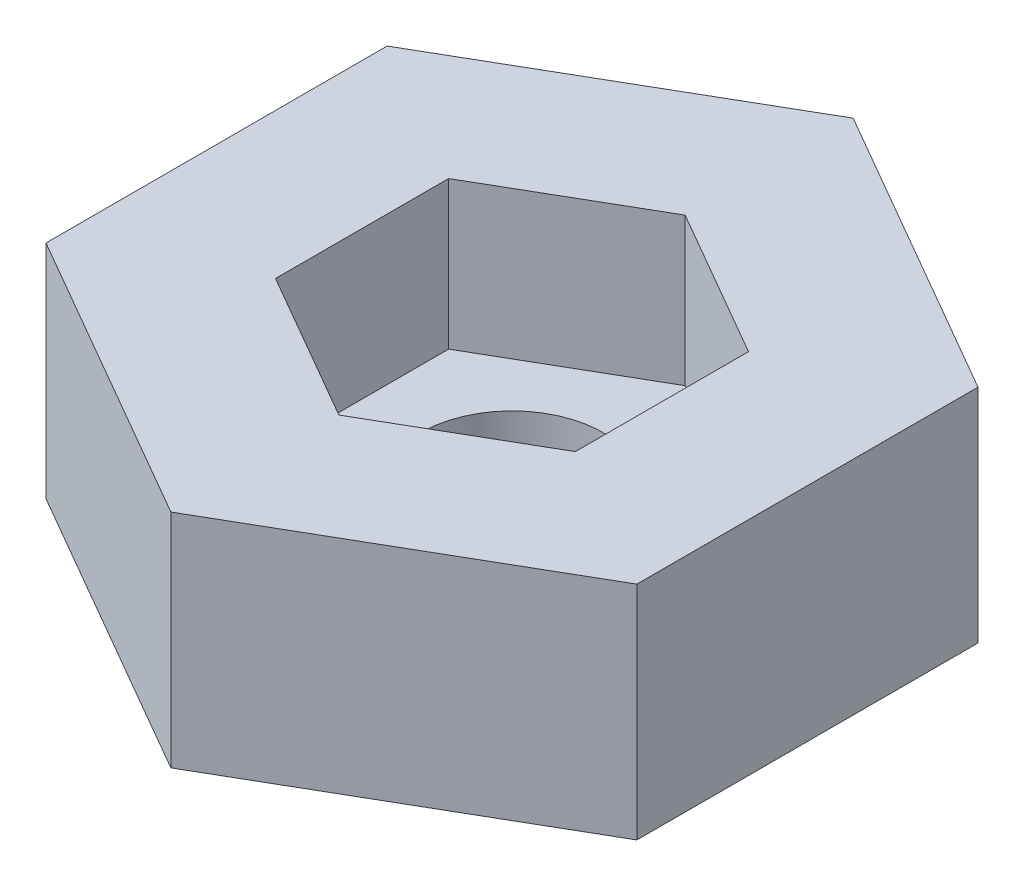
ISO-10303-21;
HEADER;
FILE_DESCRIPTION(('STEP AP214'),'2;1');
FILE_NAME('part.step','',(''),(''),'','','');
FILE_SCHEMA(('AUTOMOTIVE_DESIGN { 1 0 10303 214 1 1 1 1 }'));
ENDSEC;
DATA;
#1=APPLICATION_CONTEXT('core data for automotive mechanical design processes');
#2=APPLICATION_PROTOCOL_DEFINITION('international standard','automotive_design',2000,#1);
#3=PRODUCT_CONTEXT('',#1,'mechanical');
#4=PRODUCT('Part','Part','',(#3));
#5=PRODUCT_RELATED_PRODUCT_CATEGORY('part','',(#4));
#6=PRODUCT_DEFINITION_FORMATION('','',#4);
#7=PRODUCT_DEFINITION_CONTEXT('part definition',#1,'design');
#8=PRODUCT_DEFINITION('design','',#6,#7);
#9=PRODUCT_DEFINITION_SHAPE('','',#8);
#10=(LENGTH_UNIT() NAMED_UNIT(*) SI_UNIT(.MILLI.,.METRE.));
#11=(NAMED_UNIT(*) PLANE_ANGLE_UNIT() SI_UNIT($,.RADIAN.));
#12=(NAMED_UNIT(*) SI_UNIT($,.STERADIAN.) SOLID_ANGLE_UNIT());
#13=UNCERTAINTY_MEASURE_WITH_UNIT(LENGTH_MEASURE(1.E-05),#10,'distance_accuracy_value','');
#14=(GEOMETRIC_REPRESENTATION_CONTEXT(3) GLOBAL_UNCERTAINTY_ASSIGNED_CONTEXT((#13)) GLOBAL_UNIT_ASSIGNED_CONTEXT((#10,
#11,#12)) REPRESENTATION_CONTEXT('',''));
#15=CARTESIAN_POINT('',(0.,0.,0.));
#16=DIRECTION('',(0.,0.,1.));
#17=DIRECTION('',(1.,0.,0.));
#18=AXIS2_PLACEMENT_3D('',#15,#16,#17);
#19=CARTESIAN_POINT('',(0.,3.75,0.));
#20=DIRECTION('',(0.,-1.,0.));
#21=DIRECTION('',(0.,0.,-1.));
#22=AXIS2_PLACEMENT_3D('',#19,#20,#21);
#23=CYLINDRICAL_SURFACE('',#22,3.1);
#24=CARTESIAN_POINT('',(0.,-3.75,0.));
#25=DIRECTION('',(0.,1.,0.));
#26=DIRECTION('',(0.,0.,1.));
#27=AXIS2_PLACEMENT_3D('',#24,#25,#26);
#28=CIRCLE('',#27,3.1);
#29=CARTESIAN_POINT('',(0.,-3.75,3.1));
#30=VERTEX_POINT('',#29);
#31=EDGE_CURVE('E136',#30,#30,#28,.T.);
#32=ORIENTED_EDGE('',*,*,#31,.F.);
#33=EDGE_LOOP('',(#32));
#34=FACE_BOUND('',#33,.T.);
#35=CARTESIAN_POINT('',(0.,-1.25,0.));
#36=DIRECTION('',(0.,1.,0.));
#37=DIRECTION('',(0.,0.,1.));
#38=AXIS2_PLACEMENT_3D('',#35,#36,#37);
#39=CIRCLE('',#38,3.1);
#40=CARTESIAN_POINT('',(0.,-1.25,3.1));
#41=VERTEX_POINT('',#40);
#42=EDGE_CURVE('E38',#41,#41,#39,.T.);
#43=ORIENTED_EDGE('',*,*,#42,.T.);
#44=EDGE_LOOP('',(#43));
#45=FACE_BOUND('',#44,.T.);
#46=ADVANCED_FACE('F34',(#34,#45),#23,.F.);
#47=CARTESIAN_POINT('',(0.,3.75,0.));
#48=DIRECTION('',(0.,1.,0.));
#49=DIRECTION('',(0.,0.,1.));
#50=AXIS2_PLACEMENT_3D('',#47,#48,#49);
#51=PLANE('',#50);
#52=DIRECTION('',(-0.866025403784439,0.,-0.5));
#53=VECTOR('',#52,1.);
#54=CARTESIAN_POINT('',(5.075,3.75,-2.93005261613735));
#55=LINE('',#54,#53);
#56=CARTESIAN_POINT('',(5.075,3.75,-2.93005261613735));
#57=VERTEX_POINT('',#56);
#58=CARTESIAN_POINT('',(0.,3.75,-5.8601052322747));
#59=VERTEX_POINT('',#58);
#60=EDGE_CURVE('E50',#57,#59,#55,.T.);
#61=ORIENTED_EDGE('',*,*,#60,.F.);
#62=DIRECTION('',(0.,0.,-1.));
#63=VECTOR('',#62,1.);
#64=CARTESIAN_POINT('',(5.075,3.75,2.93005261613735));
#65=LINE('',#64,#63);
#66=CARTESIAN_POINT('',(5.075,3.75,2.93005261613735));
#67=VERTEX_POINT('',#66);
#68=EDGE_CURVE('E182',#67,#57,#65,.T.);
#69=ORIENTED_EDGE('',*,*,#68,.F.);
#70=DIRECTION('',(0.866025403784439,0.,-0.5));
#71=VECTOR('',#70,1.);
#72=CARTESIAN_POINT('',(0.,3.75,5.8601052322747));
#73=LINE('',#72,#71);
#74=CARTESIAN_POINT('',(0.,3.75,5.8601052322747));
#75=VERTEX_POINT('',#74);
#76=EDGE_CURVE('E186',#75,#67,#73,.T.);
#77=ORIENTED_EDGE('',*,*,#76,.F.);
#78=DIRECTION('',(0.866025403784439,0.,0.5));
#79=VECTOR('',#78,1.);
#80=CARTESIAN_POINT('',(-5.075,3.75,2.93005261613735));
#81=LINE('',#80,#79);
#82=CARTESIAN_POINT('',(-5.075,3.75,2.93005261613735));
#83=VERTEX_POINT('',#82);
#84=EDGE_CURVE('E189',#83,#75,#81,.T.);
#85=ORIENTED_EDGE('',*,*,#84,.F.);
#86=DIRECTION('',(0.,0.,1.));
#87=VECTOR('',#86,1.);
#88=CARTESIAN_POINT('',(-5.075,3.75,-2.93005261613735));
#89=LINE('',#88,#87);
#90=CARTESIAN_POINT('',(-5.075,3.75,-2.93005261613735));
#91=VERTEX_POINT('',#90);
#92=EDGE_CURVE('E192',#91,#83,#89,.T.);
#93=ORIENTED_EDGE('',*,*,#92,.F.);
#94=DIRECTION('',(-0.866025403784439,0.,0.5));
#95=VECTOR('',#94,1.);
#96=CARTESIAN_POINT('',(0.,3.75,-5.8601052322747));
#97=LINE('',#96,#95);
#98=EDGE_CURVE('E195',#59,#91,#97,.T.);
#99=ORIENTED_EDGE('',*,*,#98,.F.);
#100=EDGE_LOOP('',(#61,#69,#77,#85,#93,#99));
#101=FACE_BOUND('',#100,.T.);
#102=DIRECTION('',(0.866025403784441,0.,0.499999999999995));
#103=VECTOR('',#102,1.);
#104=CARTESIAN_POINT('',(-9.99999999999994,3.75,5.77350269189638));
#105=LINE('',#104,#103);
#106=CARTESIAN_POINT('',(-9.99999999999994,3.75,5.77350269189638));
#107=VERTEX_POINT('',#106);
#108=CARTESIAN_POINT('',(0.,3.75,11.5470053837925));
#109=VERTEX_POINT('',#108);
#110=EDGE_CURVE('E144',#107,#109,#105,.T.);
#111=ORIENTED_EDGE('',*,*,#110,.T.);
#112=DIRECTION('',(0.866025403784438,0.,-0.500000000000001));
#113=VECTOR('',#112,1.);
#114=CARTESIAN_POINT('',(0.,3.75,11.5470053837925));
#115=LINE('',#114,#113);
#116=CARTESIAN_POINT('',(10.,3.75,5.77350269189624));
#117=VERTEX_POINT('',#116);
#118=EDGE_CURVE('E94',#109,#117,#115,.T.);
#119=ORIENTED_EDGE('',*,*,#118,.T.);
#120=DIRECTION('',(0.,0.,-1.));
#121=VECTOR('',#120,1.);
#122=CARTESIAN_POINT('',(10.,3.75,5.77350269189624));
#123=LINE('',#122,#121);
#124=CARTESIAN_POINT('',(9.99999999999998,3.75,-5.77350269189631));
#125=VERTEX_POINT('',#124);
#126=EDGE_CURVE('E111',#117,#125,#123,.T.);
#127=ORIENTED_EDGE('',*,*,#126,.T.);
#128=DIRECTION('',(-0.866025403784442,0.,-0.499999999999995));
#129=VECTOR('',#128,1.);
#130=CARTESIAN_POINT('',(9.99999999999998,3.75,-5.77350269189631));
#131=LINE('',#130,#129);
#132=CARTESIAN_POINT('',(0.,3.75,-11.5470053837925));
#133=VERTEX_POINT('',#132);
#134=EDGE_CURVE('E104',#125,#133,#131,.T.);
#135=ORIENTED_EDGE('',*,*,#134,.T.);
#136=DIRECTION('',(-0.866025403784435,0.,0.500000000000007));
#137=VECTOR('',#136,1.);
#138=CARTESIAN_POINT('',(0.,3.75,-11.5470053837925));
#139=LINE('',#138,#137);
#140=CARTESIAN_POINT('',(-10.0000000000001,3.75,-5.77350269189617));
#141=VERTEX_POINT('',#140);
#142=EDGE_CURVE('E108',#133,#141,#139,.T.);
#143=ORIENTED_EDGE('',*,*,#142,.T.);
#144=DIRECTION('',(0.,0.,1.));
#145=VECTOR('',#144,1.);
#146=CARTESIAN_POINT('',(-10.0000000000001,3.75,-5.77350269189617));
#147=LINE('',#146,#145);
#148=EDGE_CURVE('E59',#141,#107,#147,.T.);
#149=ORIENTED_EDGE('',*,*,#148,.T.);
#150=EDGE_LOOP('',(#111,#119,#127,#135,#143,#149));
#151=FACE_BOUND('',#150,.T.);
#152=ADVANCED_FACE('F106',(#101,#151),#51,.T.);
#153=CARTESIAN_POINT('',(0.,-3.75,0.));
#154=DIRECTION('',(0.,1.,0.));
#155=DIRECTION('',(0.,0.,1.));
#156=AXIS2_PLACEMENT_3D('',#153,#154,#155);
#157=PLANE('',#156);
#158=DIRECTION('',(0.866025403784441,0.,0.499999999999995));
#159=VECTOR('',#158,1.);
#160=CARTESIAN_POINT('',(-9.99999999999994,-3.75,5.77350269189638));
#161=LINE('',#160,#159);
#162=CARTESIAN_POINT('',(-9.99999999999994,-3.75,5.77350269189638));
#163=VERTEX_POINT('',#162);
#164=CARTESIAN_POINT('',(0.,-3.75,11.5470053837925));
#165=VERTEX_POINT('',#164);
#166=EDGE_CURVE('E132',#163,#165,#161,.T.);
#167=ORIENTED_EDGE('',*,*,#166,.F.);
#168=DIRECTION('',(0.,0.,1.));
#169=VECTOR('',#168,1.);
#170=CARTESIAN_POINT('',(-10.0000000000001,-3.75,-5.77350269189617));
#171=LINE('',#170,#169);
#172=CARTESIAN_POINT('',(-10.0000000000001,-3.75,-5.77350269189617));
#173=VERTEX_POINT('',#172);
#174=EDGE_CURVE('E86',#173,#163,#171,.T.);
#175=ORIENTED_EDGE('',*,*,#174,.F.);
#176=DIRECTION('',(-0.866025403784435,0.,0.500000000000007));
#177=VECTOR('',#176,1.);
#178=CARTESIAN_POINT('',(0.,-3.75,-11.5470053837925));
#179=LINE('',#178,#177);
#180=CARTESIAN_POINT('',(0.,-3.75,-11.5470053837925));
#181=VERTEX_POINT('',#180);
#182=EDGE_CURVE('E141',#181,#173,#179,.T.);
#183=ORIENTED_EDGE('',*,*,#182,.F.);
#184=DIRECTION('',(-0.866025403784442,0.,-0.499999999999995));
#185=VECTOR('',#184,1.);
#186=CARTESIAN_POINT('',(9.99999999999998,-3.75,-5.77350269189631));
#187=LINE('',#186,#185);
#188=CARTESIAN_POINT('',(9.99999999999998,-3.75,-5.77350269189631));
#189=VERTEX_POINT('',#188);
#190=EDGE_CURVE('E120',#189,#181,#187,.T.);
#191=ORIENTED_EDGE('',*,*,#190,.F.);
#192=DIRECTION('',(0.,0.,-1.));
#193=VECTOR('',#192,1.);
#194=CARTESIAN_POINT('',(10.,-3.75,5.77350269189624));
#195=LINE('',#194,#193);
#196=CARTESIAN_POINT('',(10.,-3.75,5.77350269189624));
#197=VERTEX_POINT('',#196);
#198=EDGE_CURVE('E138',#197,#189,#195,.T.);
#199=ORIENTED_EDGE('',*,*,#198,.F.);
#200=DIRECTION('',(0.866025403784438,0.,-0.500000000000001));
#201=VECTOR('',#200,1.);
#202=CARTESIAN_POINT('',(0.,-3.75,11.5470053837925));
#203=LINE('',#202,#201);
#204=EDGE_CURVE('E135',#165,#197,#203,.T.);
#205=ORIENTED_EDGE('',*,*,#204,.F.);
#206=EDGE_LOOP('',(#167,#175,#183,#191,#199,#205));
#207=FACE_BOUND('',#206,.T.);
#208=ORIENTED_EDGE('',*,*,#31,.T.);
#209=EDGE_LOOP('',(#208));
#210=FACE_BOUND('',#209,.T.);
#211=ADVANCED_FACE('F154',(#207,#210),#157,.F.);
#212=CARTESIAN_POINT('',(-9.99999999999994,3.75,5.77350269189638));
#213=DIRECTION('',(0.499999999999995,0.,-0.866025403784441));
#214=DIRECTION('',(-0.866025403784441,0.,-0.499999999999995));
#215=AXIS2_PLACEMENT_3D('',#212,#213,#214);
#216=PLANE('',#215);
#217=ORIENTED_EDGE('',*,*,#166,.T.);
#218=DIRECTION('',(0.,-1.,0.));
#219=VECTOR('',#218,1.);
#220=CARTESIAN_POINT('',(0.,3.75,11.5470053837925));
#221=LINE('',#220,#219);
#222=EDGE_CURVE('E11',#109,#165,#221,.T.);
#223=ORIENTED_EDGE('',*,*,#222,.F.);
#224=ORIENTED_EDGE('',*,*,#110,.F.);
#225=DIRECTION('',(0.,-1.,0.));
#226=VECTOR('',#225,1.);
#227=CARTESIAN_POINT('',(-9.99999999999994,3.75,5.77350269189638));
#228=LINE('',#227,#226);
#229=EDGE_CURVE('E128',#107,#163,#228,.T.);
#230=ORIENTED_EDGE('',*,*,#229,.T.);
#231=EDGE_LOOP('',(#217,#223,#224,#230));
#232=FACE_BOUND('',#231,.T.);
#233=ADVANCED_FACE('F36',(#232),#216,.F.);
#234=CARTESIAN_POINT('',(0.,3.75,11.5470053837925));
#235=DIRECTION('',(-0.500000000000001,0.,-0.866025403784438));
#236=DIRECTION('',(-0.866025403784438,0.,0.500000000000001));
#237=AXIS2_PLACEMENT_3D('',#234,#235,#236);
#238=PLANE('',#237);
#239=ORIENTED_EDGE('',*,*,#204,.T.);
#240=DIRECTION('',(0.,-1.,0.));
#241=VECTOR('',#240,1.);
#242=CARTESIAN_POINT('',(10.,3.75,5.77350269189624));
#243=LINE('',#242,#241);
#244=EDGE_CURVE('E43',#117,#197,#243,.T.);
#245=ORIENTED_EDGE('',*,*,#244,.F.);
#246=ORIENTED_EDGE('',*,*,#118,.F.);
#247=ORIENTED_EDGE('',*,*,#222,.T.);
#248=EDGE_LOOP('',(#239,#245,#246,#247));
#249=FACE_BOUND('',#248,.T.);
#250=ADVANCED_FACE('F291',(#249),#238,.F.);
#251=CARTESIAN_POINT('',(10.,3.75,5.77350269189624));
#252=DIRECTION('',(-1.,0.,0.));
#253=DIRECTION('',(0.,0.,1.));
#254=AXIS2_PLACEMENT_3D('',#251,#252,#253);
#255=PLANE('',#254);
#256=ORIENTED_EDGE('',*,*,#198,.T.);
#257=DIRECTION('',(0.,-1.,0.));
#258=VECTOR('',#257,1.);
#259=CARTESIAN_POINT('',(9.99999999999998,3.75,-5.77350269189631));
#260=LINE('',#259,#258);
#261=EDGE_CURVE('E123',#125,#189,#260,.T.);
#262=ORIENTED_EDGE('',*,*,#261,.F.);
#263=ORIENTED_EDGE('',*,*,#126,.F.);
#264=ORIENTED_EDGE('',*,*,#244,.T.);
#265=EDGE_LOOP('',(#256,#262,#263,#264));
#266=FACE_BOUND('',#265,.T.);
#267=ADVANCED_FACE('F151',(#266),#255,.F.);
#268=CARTESIAN_POINT('',(9.99999999999998,3.75,-5.77350269189631));
#269=DIRECTION('',(-0.499999999999995,0.,0.866025403784442));
#270=DIRECTION('',(0.866025403784442,0.,0.499999999999995));
#271=AXIS2_PLACEMENT_3D('',#268,#269,#270);
#272=PLANE('',#271);
#273=ORIENTED_EDGE('',*,*,#190,.T.);
#274=DIRECTION('',(0.,-1.,0.));
#275=VECTOR('',#274,1.);
#276=CARTESIAN_POINT('',(0.,3.75,-11.5470053837925));
#277=LINE('',#276,#275);
#278=EDGE_CURVE('E117',#133,#181,#277,.T.);
#279=ORIENTED_EDGE('',*,*,#278,.F.);
#280=ORIENTED_EDGE('',*,*,#134,.F.);
#281=ORIENTED_EDGE('',*,*,#261,.T.);
#282=EDGE_LOOP('',(#273,#279,#280,#281));
#283=FACE_BOUND('',#282,.T.);
#284=ADVANCED_FACE('F118',(#283),#272,.F.);
#285=CARTESIAN_POINT('',(0.,3.75,-11.5470053837925));
#286=DIRECTION('',(0.500000000000007,0.,0.866025403784435));
#287=DIRECTION('',(0.866025403784435,0.,-0.500000000000007));
#288=AXIS2_PLACEMENT_3D('',#285,#286,#287);
#289=PLANE('',#288);
#290=ORIENTED_EDGE('',*,*,#182,.T.);
#291=DIRECTION('',(0.,-1.,0.));
#292=VECTOR('',#291,1.);
#293=CARTESIAN_POINT('',(-10.0000000000001,3.75,-5.77350269189617));
#294=LINE('',#293,#292);
#295=EDGE_CURVE('E124',#141,#173,#294,.T.);
#296=ORIENTED_EDGE('',*,*,#295,.F.);
#297=ORIENTED_EDGE('',*,*,#142,.F.);
#298=ORIENTED_EDGE('',*,*,#278,.T.);
#299=EDGE_LOOP('',(#290,#296,#297,#298));
#300=FACE_BOUND('',#299,.T.);
#301=ADVANCED_FACE('F126',(#300),#289,.F.);
#302=CARTESIAN_POINT('',(-10.0000000000001,3.75,-5.77350269189617));
#303=DIRECTION('',(1.,0.,0.));
#304=DIRECTION('',(0.,0.,-1.));
#305=AXIS2_PLACEMENT_3D('',#302,#303,#304);
#306=PLANE('',#305);
#307=ORIENTED_EDGE('',*,*,#174,.T.);
#308=ORIENTED_EDGE('',*,*,#229,.F.);
#309=ORIENTED_EDGE('',*,*,#148,.F.);
#310=ORIENTED_EDGE('',*,*,#295,.T.);
#311=EDGE_LOOP('',(#307,#308,#309,#310));
#312=FACE_BOUND('',#311,.T.);
#313=ADVANCED_FACE('F156',(#312),#306,.F.);
#314=CARTESIAN_POINT('',(5.075,-1.25,-2.93005261613735));
#315=DIRECTION('',(0.5,0.,-0.866025403784439));
#316=DIRECTION('',(-0.866025403784439,0.,-0.5));
#317=AXIS2_PLACEMENT_3D('',#314,#315,#316);
#318=PLANE('',#317);
#319=ORIENTED_EDGE('',*,*,#60,.T.);
#320=DIRECTION('',(0.,1.,0.));
#321=VECTOR('',#320,1.);
#322=CARTESIAN_POINT('',(0.,-1.25,-5.8601052322747));
#323=LINE('',#322,#321);
#324=CARTESIAN_POINT('',(0.,-1.25,-5.8601052322747));
#325=VERTEX_POINT('',#324);
#326=EDGE_CURVE('E165',#325,#59,#323,.T.);
#327=ORIENTED_EDGE('',*,*,#326,.F.);
#328=DIRECTION('',(-0.866025403784439,0.,-0.5));
#329=VECTOR('',#328,1.);
#330=CARTESIAN_POINT('',(5.075,-1.25,-2.93005261613735));
#331=LINE('',#330,#329);
#332=CARTESIAN_POINT('',(5.075,-1.25,-2.93005261613735));
#333=VERTEX_POINT('',#332);
#334=EDGE_CURVE('E185',#333,#325,#331,.T.);
#335=ORIENTED_EDGE('',*,*,#334,.F.);
#336=DIRECTION('',(0.,1.,0.));
#337=VECTOR('',#336,1.);
#338=CARTESIAN_POINT('',(5.075,-1.25,-2.93005261613735));
#339=LINE('',#338,#337);
#340=EDGE_CURVE('E180',#333,#57,#339,.T.);
#341=ORIENTED_EDGE('',*,*,#340,.T.);
#342=EDGE_LOOP('',(#319,#327,#335,#341));
#343=FACE_BOUND('',#342,.T.);
#344=ADVANCED_FACE('F222',(#343),#318,.F.);
#345=CARTESIAN_POINT('',(5.075,-1.25,2.93005261613735));
#346=DIRECTION('',(1.,0.,0.));
#347=DIRECTION('',(0.,0.,-1.));
#348=AXIS2_PLACEMENT_3D('',#345,#346,#347);
#349=PLANE('',#348);
#350=ORIENTED_EDGE('',*,*,#68,.T.);
#351=ORIENTED_EDGE('',*,*,#340,.F.);
#352=DIRECTION('',(0.,0.,-1.));
#353=VECTOR('',#352,1.);
#354=CARTESIAN_POINT('',(5.075,-1.25,2.93005261613735));
#355=LINE('',#354,#353);
#356=CARTESIAN_POINT('',(5.075,-1.25,2.93005261613735));
#357=VERTEX_POINT('',#356);
#358=EDGE_CURVE('E168',#357,#333,#355,.T.);
#359=ORIENTED_EDGE('',*,*,#358,.F.);
#360=DIRECTION('',(0.,1.,0.));
#361=VECTOR('',#360,1.);
#362=CARTESIAN_POINT('',(5.075,-1.25,2.93005261613735));
#363=LINE('',#362,#361);
#364=EDGE_CURVE('E177',#357,#67,#363,.T.);
#365=ORIENTED_EDGE('',*,*,#364,.T.);
#366=EDGE_LOOP('',(#350,#351,#359,#365));
#367=FACE_BOUND('',#366,.T.);
#368=ADVANCED_FACE('F238',(#367),#349,.F.);
#369=CARTESIAN_POINT('',(0.,-1.25,5.8601052322747));
#370=DIRECTION('',(0.5,0.,0.866025403784439));
#371=DIRECTION('',(0.866025403784439,0.,-0.5));
#372=AXIS2_PLACEMENT_3D('',#369,#370,#371);
#373=PLANE('',#372);
#374=ORIENTED_EDGE('',*,*,#76,.T.);
#375=ORIENTED_EDGE('',*,*,#364,.F.);
#376=DIRECTION('',(0.866025403784439,0.,-0.5));
#377=VECTOR('',#376,1.);
#378=CARTESIAN_POINT('',(0.,-1.25,5.8601052322747));
#379=LINE('',#378,#377);
#380=CARTESIAN_POINT('',(0.,-1.25,5.8601052322747));
#381=VERTEX_POINT('',#380);
#382=EDGE_CURVE('E201',#381,#357,#379,.T.);
#383=ORIENTED_EDGE('',*,*,#382,.F.);
#384=DIRECTION('',(0.,1.,0.));
#385=VECTOR('',#384,1.);
#386=CARTESIAN_POINT('',(0.,-1.25,5.8601052322747));
#387=LINE('',#386,#385);
#388=EDGE_CURVE('E174',#381,#75,#387,.T.);
#389=ORIENTED_EDGE('',*,*,#388,.T.);
#390=EDGE_LOOP('',(#374,#375,#383,#389));
#391=FACE_BOUND('',#390,.T.);
#392=ADVANCED_FACE('F243',(#391),#373,.F.);
#393=CARTESIAN_POINT('',(-5.075,-1.25,2.93005261613735));
#394=DIRECTION('',(-0.5,0.,0.866025403784439));
#395=DIRECTION('',(0.866025403784439,0.,0.5));
#396=AXIS2_PLACEMENT_3D('',#393,#394,#395);
#397=PLANE('',#396);
#398=ORIENTED_EDGE('',*,*,#84,.T.);
#399=ORIENTED_EDGE('',*,*,#388,.F.);
#400=DIRECTION('',(0.866025403784439,0.,0.5));
#401=VECTOR('',#400,1.);
#402=CARTESIAN_POINT('',(-5.075,-1.25,2.93005261613735));
#403=LINE('',#402,#401);
#404=CARTESIAN_POINT('',(-5.075,-1.25,2.93005261613735));
#405=VERTEX_POINT('',#404);
#406=EDGE_CURVE('E204',#405,#381,#403,.T.);
#407=ORIENTED_EDGE('',*,*,#406,.F.);
#408=DIRECTION('',(0.,1.,0.));
#409=VECTOR('',#408,1.);
#410=CARTESIAN_POINT('',(-5.075,-1.25,2.93005261613735));
#411=LINE('',#410,#409);
#412=EDGE_CURVE('E171',#405,#83,#411,.T.);
#413=ORIENTED_EDGE('',*,*,#412,.T.);
#414=EDGE_LOOP('',(#398,#399,#407,#413));
#415=FACE_BOUND('',#414,.T.);
#416=ADVANCED_FACE('F261',(#415),#397,.F.);
#417=CARTESIAN_POINT('',(-5.075,-1.25,-2.93005261613735));
#418=DIRECTION('',(-1.,0.,0.));
#419=DIRECTION('',(0.,0.,1.));
#420=AXIS2_PLACEMENT_3D('',#417,#418,#419);
#421=PLANE('',#420);
#422=ORIENTED_EDGE('',*,*,#92,.T.);
#423=ORIENTED_EDGE('',*,*,#412,.F.);
#424=DIRECTION('',(0.,0.,1.));
#425=VECTOR('',#424,1.);
#426=CARTESIAN_POINT('',(-5.075,-1.25,-2.93005261613735));
#427=LINE('',#426,#425);
#428=CARTESIAN_POINT('',(-5.075,-1.25,-2.93005261613735));
#429=VERTEX_POINT('',#428);
#430=EDGE_CURVE('E207',#429,#405,#427,.T.);
#431=ORIENTED_EDGE('',*,*,#430,.F.);
#432=DIRECTION('',(0.,1.,0.));
#433=VECTOR('',#432,1.);
#434=CARTESIAN_POINT('',(-5.075,-1.25,-2.93005261613735));
#435=LINE('',#434,#433);
#436=EDGE_CURVE('E167',#429,#91,#435,.T.);
#437=ORIENTED_EDGE('',*,*,#436,.T.);
#438=EDGE_LOOP('',(#422,#423,#431,#437));
#439=FACE_BOUND('',#438,.T.);
#440=ADVANCED_FACE('F257',(#439),#421,.F.);
#441=CARTESIAN_POINT('',(0.,-1.25,-5.8601052322747));
#442=DIRECTION('',(-0.5,0.,-0.866025403784439));
#443=DIRECTION('',(-0.866025403784439,0.,0.5));
#444=AXIS2_PLACEMENT_3D('',#441,#442,#443);
#445=PLANE('',#444);
#446=ORIENTED_EDGE('',*,*,#98,.T.);
#447=ORIENTED_EDGE('',*,*,#436,.F.);
#448=DIRECTION('',(-0.866025403784439,0.,0.5));
#449=VECTOR('',#448,1.);
#450=CARTESIAN_POINT('',(0.,-1.25,-5.8601052322747));
#451=LINE('',#450,#449);
#452=EDGE_CURVE('E210',#325,#429,#451,.T.);
#453=ORIENTED_EDGE('',*,*,#452,.F.);
#454=ORIENTED_EDGE('',*,*,#326,.T.);
#455=EDGE_LOOP('',(#446,#447,#453,#454));
#456=FACE_BOUND('',#455,.T.);
#457=ADVANCED_FACE('F251',(#456),#445,.F.);
#458=CARTESIAN_POINT('',(0.,-1.25,0.));
#459=DIRECTION('',(0.,1.,0.));
#460=DIRECTION('',(0.,0.,1.));
#461=AXIS2_PLACEMENT_3D('',#458,#459,#460);
#462=PLANE('',#461);
#463=ORIENTED_EDGE('',*,*,#42,.F.);
#464=EDGE_LOOP('',(#463));
#465=FACE_BOUND('',#464,.T.);
#466=ORIENTED_EDGE('',*,*,#334,.T.);
#467=ORIENTED_EDGE('',*,*,#452,.T.);
#468=ORIENTED_EDGE('',*,*,#430,.T.);
#469=ORIENTED_EDGE('',*,*,#406,.T.);
#470=ORIENTED_EDGE('',*,*,#382,.T.);
#471=ORIENTED_EDGE('',*,*,#358,.T.);
#472=EDGE_LOOP('',(#466,#467,#468,#469,#470,#471));
#473=FACE_BOUND('',#472,.T.);
#474=ADVANCED_FACE('F217',(#465,#473),#462,.T.);
#475=CLOSED_SHELL('',(#46,#152,#211,#233,#250,#267,#284,#301,#313,#344,#368,#392,#416,#440,#457,#474));
#476=MANIFOLD_SOLID_BREP('B2',#475);
#477=ADVANCED_BREP_SHAPE_REPRESENTATION('',(#18,#476),#14);
#478=SHAPE_DEFINITION_REPRESENTATION(#9,#477);
ENDSEC;
END-ISO-10303-21;
